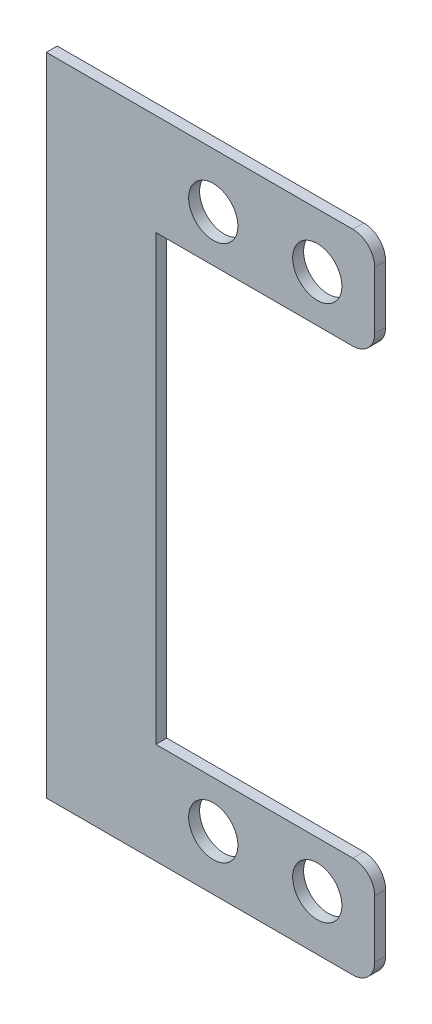
ISO-10303-21;
HEADER;
FILE_DESCRIPTION(('STEP AP214'),'2;1');
FILE_NAME('part.step','',(''),(''),'','','');
FILE_SCHEMA(('AUTOMOTIVE_DESIGN { 1 0 10303 214 1 1 1 1 }'));
ENDSEC;
DATA;
#1=APPLICATION_CONTEXT('core data for automotive mechanical design processes');
#2=APPLICATION_PROTOCOL_DEFINITION('international standard','automotive_design',2000,#1);
#3=PRODUCT_CONTEXT('',#1,'mechanical');
#4=PRODUCT('Part','Part','',(#3));
#5=PRODUCT_RELATED_PRODUCT_CATEGORY('part','',(#4));
#6=PRODUCT_DEFINITION_FORMATION('','',#4);
#7=PRODUCT_DEFINITION_CONTEXT('part definition',#1,'design');
#8=PRODUCT_DEFINITION('design','',#6,#7);
#9=PRODUCT_DEFINITION_SHAPE('','',#8);
#10=(LENGTH_UNIT() NAMED_UNIT(*) SI_UNIT(.MILLI.,.METRE.));
#11=(NAMED_UNIT(*) PLANE_ANGLE_UNIT() SI_UNIT($,.RADIAN.));
#12=(NAMED_UNIT(*) SI_UNIT($,.STERADIAN.) SOLID_ANGLE_UNIT());
#13=UNCERTAINTY_MEASURE_WITH_UNIT(LENGTH_MEASURE(1.E-05),#10,'distance_accuracy_value','');
#14=(GEOMETRIC_REPRESENTATION_CONTEXT(3) GLOBAL_UNCERTAINTY_ASSIGNED_CONTEXT((#13)) GLOBAL_UNIT_ASSIGNED_CONTEXT((#10,
#11,#12)) REPRESENTATION_CONTEXT('',''));
#15=CARTESIAN_POINT('',(0.,0.,0.));
#16=DIRECTION('',(0.,0.,1.));
#17=DIRECTION('',(1.,0.,0.));
#18=AXIS2_PLACEMENT_3D('',#15,#16,#17);
#19=CARTESIAN_POINT('',(18.,42.5,1.));
#20=DIRECTION('',(0.,0.,1.));
#21=DIRECTION('',(1.,0.,0.));
#22=AXIS2_PLACEMENT_3D('',#19,#20,#21);
#23=PLANE('',#22);
#24=CARTESIAN_POINT('',(14.75,-4.25,1.));
#25=DIRECTION('',(0.,0.,1.));
#26=DIRECTION('',(1.,0.,0.));
#27=AXIS2_PLACEMENT_3D('',#24,#25,#26);
#28=CIRCLE('',#27,2.25);
#29=CARTESIAN_POINT('',(17.,-4.25,1.));
#30=VERTEX_POINT('',#29);
#31=EDGE_CURVE('E295',#30,#30,#28,.T.);
#32=ORIENTED_EDGE('',*,*,#31,.F.);
#33=EDGE_LOOP('',(#32));
#34=FACE_BOUND('',#33,.T.);
#35=CARTESIAN_POINT('',(5.25,44.75,1.));
#36=DIRECTION('',(0.,0.,1.));
#37=DIRECTION('',(1.,0.,0.));
#38=AXIS2_PLACEMENT_3D('',#35,#36,#37);
#39=CIRCLE('',#38,2.25);
#40=CARTESIAN_POINT('',(7.5,44.75,1.));
#41=VERTEX_POINT('',#40);
#42=EDGE_CURVE('E161',#41,#41,#39,.T.);
#43=ORIENTED_EDGE('',*,*,#42,.F.);
#44=EDGE_LOOP('',(#43));
#45=FACE_BOUND('',#44,.T.);
#46=DIRECTION('',(0.,1.,0.));
#47=VECTOR('',#46,1.);
#48=CARTESIAN_POINT('',(0.,0.,1.));
#49=LINE('',#48,#47);
#50=CARTESIAN_POINT('',(0.,0.,1.));
#51=VERTEX_POINT('',#50);
#52=CARTESIAN_POINT('',(0.,40.5,1.));
#53=VERTEX_POINT('',#52);
#54=EDGE_CURVE('E180',#51,#53,#49,.T.);
#55=ORIENTED_EDGE('',*,*,#54,.T.);
#56=DIRECTION('',(1.,0.,0.));
#57=VECTOR('',#56,1.);
#58=CARTESIAN_POINT('',(0.,40.5,1.));
#59=LINE('',#58,#57);
#60=CARTESIAN_POINT('',(18.,40.5,1.));
#61=VERTEX_POINT('',#60);
#62=EDGE_CURVE('E108',#53,#61,#59,.T.);
#63=ORIENTED_EDGE('',*,*,#62,.T.);
#64=CARTESIAN_POINT('',(18.,42.5,1.));
#65=DIRECTION('',(0.,0.,1.));
#66=DIRECTION('',(1.,0.,0.));
#67=AXIS2_PLACEMENT_3D('',#64,#65,#66);
#68=CIRCLE('',#67,2.);
#69=CARTESIAN_POINT('',(20.,42.5,1.));
#70=VERTEX_POINT('',#69);
#71=EDGE_CURVE('E207',#61,#70,#68,.T.);
#72=ORIENTED_EDGE('',*,*,#71,.T.);
#73=DIRECTION('',(0.,1.,0.));
#74=VECTOR('',#73,1.);
#75=CARTESIAN_POINT('',(20.,42.5,1.));
#76=LINE('',#75,#74);
#77=CARTESIAN_POINT('',(20.,47.75,1.));
#78=VERTEX_POINT('',#77);
#79=EDGE_CURVE('E226',#70,#78,#76,.T.);
#80=ORIENTED_EDGE('',*,*,#79,.T.);
#81=CARTESIAN_POINT('',(18.,47.75,1.));
#82=DIRECTION('',(0.,0.,1.));
#83=DIRECTION('',(1.,0.,0.));
#84=AXIS2_PLACEMENT_3D('',#81,#82,#83);
#85=CIRCLE('',#84,2.);
#86=CARTESIAN_POINT('',(18.,49.75,1.));
#87=VERTEX_POINT('',#86);
#88=EDGE_CURVE('E223',#78,#87,#85,.T.);
#89=ORIENTED_EDGE('',*,*,#88,.T.);
#90=DIRECTION('',(-1.,0.,0.));
#91=VECTOR('',#90,1.);
#92=CARTESIAN_POINT('',(18.,49.75,1.));
#93=LINE('',#92,#91);
#94=CARTESIAN_POINT('',(-9.99999999999998,49.75,1.));
#95=VERTEX_POINT('',#94);
#96=EDGE_CURVE('E225',#87,#95,#93,.T.);
#97=ORIENTED_EDGE('',*,*,#96,.T.);
#98=DIRECTION('',(0.,-1.,0.));
#99=VECTOR('',#98,1.);
#100=CARTESIAN_POINT('',(-9.99999999999999,-9.25,1.));
#101=LINE('',#100,#99);
#102=CARTESIAN_POINT('',(-9.99999999999999,-9.25,1.));
#103=VERTEX_POINT('',#102);
#104=EDGE_CURVE('E228',#95,#103,#101,.T.);
#105=ORIENTED_EDGE('',*,*,#104,.T.);
#106=DIRECTION('',(1.,0.,0.));
#107=VECTOR('',#106,1.);
#108=CARTESIAN_POINT('',(18.,-9.25,1.));
#109=LINE('',#108,#107);
#110=CARTESIAN_POINT('',(18.,-9.25,1.));
#111=VERTEX_POINT('',#110);
#112=EDGE_CURVE('E234',#103,#111,#109,.T.);
#113=ORIENTED_EDGE('',*,*,#112,.T.);
#114=CARTESIAN_POINT('',(18.,-7.25,1.));
#115=DIRECTION('',(0.,0.,1.));
#116=DIRECTION('',(-1.,0.,0.));
#117=AXIS2_PLACEMENT_3D('',#114,#115,#116);
#118=CIRCLE('',#117,2.);
#119=CARTESIAN_POINT('',(20.,-7.24999999999999,1.));
#120=VERTEX_POINT('',#119);
#121=EDGE_CURVE('E139',#111,#120,#118,.T.);
#122=ORIENTED_EDGE('',*,*,#121,.T.);
#123=DIRECTION('',(0.,1.,0.));
#124=VECTOR('',#123,1.);
#125=CARTESIAN_POINT('',(20.,-7.24999999999999,1.));
#126=LINE('',#125,#124);
#127=CARTESIAN_POINT('',(20.,-2.00000000000001,1.));
#128=VERTEX_POINT('',#127);
#129=EDGE_CURVE('E133',#120,#128,#126,.T.);
#130=ORIENTED_EDGE('',*,*,#129,.T.);
#131=CARTESIAN_POINT('',(18.,-2.,1.));
#132=DIRECTION('',(0.,0.,1.));
#133=DIRECTION('',(-1.,0.,0.));
#134=AXIS2_PLACEMENT_3D('',#131,#132,#133);
#135=CIRCLE('',#134,2.);
#136=CARTESIAN_POINT('',(18.,0.,1.));
#137=VERTEX_POINT('',#136);
#138=EDGE_CURVE('E137',#128,#137,#135,.T.);
#139=ORIENTED_EDGE('',*,*,#138,.T.);
#140=DIRECTION('',(-1.,0.,0.));
#141=VECTOR('',#140,1.);
#142=CARTESIAN_POINT('',(0.,0.,1.));
#143=LINE('',#142,#141);
#144=EDGE_CURVE('E53',#137,#51,#143,.T.);
#145=ORIENTED_EDGE('',*,*,#144,.T.);
#146=EDGE_LOOP('',(#55,#63,#72,#80,#89,#97,#105,#113,#122,#130,#139,#145));
#147=FACE_BOUND('',#146,.T.);
#148=CARTESIAN_POINT('',(14.75,44.75,1.));
#149=DIRECTION('',(0.,0.,1.));
#150=DIRECTION('',(1.,0.,0.));
#151=AXIS2_PLACEMENT_3D('',#148,#149,#150);
#152=CIRCLE('',#151,2.25);
#153=CARTESIAN_POINT('',(17.,44.75,1.));
#154=VERTEX_POINT('',#153);
#155=EDGE_CURVE('E301',#154,#154,#152,.T.);
#156=ORIENTED_EDGE('',*,*,#155,.F.);
#157=EDGE_LOOP('',(#156));
#158=FACE_BOUND('',#157,.T.);
#159=CARTESIAN_POINT('',(5.25,-4.25,1.));
#160=DIRECTION('',(0.,0.,1.));
#161=DIRECTION('',(1.,0.,0.));
#162=AXIS2_PLACEMENT_3D('',#159,#160,#161);
#163=CIRCLE('',#162,2.25);
#164=CARTESIAN_POINT('',(7.5,-4.25,1.));
#165=VERTEX_POINT('',#164);
#166=EDGE_CURVE('E286',#165,#165,#163,.T.);
#167=ORIENTED_EDGE('',*,*,#166,.F.);
#168=EDGE_LOOP('',(#167));
#169=FACE_BOUND('',#168,.T.);
#170=ADVANCED_FACE('F36',(#34,#45,#147,#158,#169),#23,.T.);
#171=CARTESIAN_POINT('',(18.,42.5,0.));
#172=DIRECTION('',(0.,0.,1.));
#173=DIRECTION('',(1.,0.,0.));
#174=AXIS2_PLACEMENT_3D('',#171,#172,#173);
#175=PLANE('',#174);
#176=CARTESIAN_POINT('',(14.75,-4.25,0.));
#177=DIRECTION('',(0.,0.,1.));
#178=DIRECTION('',(1.,0.,0.));
#179=AXIS2_PLACEMENT_3D('',#176,#177,#178);
#180=CIRCLE('',#179,2.25);
#181=CARTESIAN_POINT('',(17.,-4.25,0.));
#182=VERTEX_POINT('',#181);
#183=EDGE_CURVE('E292',#182,#182,#180,.T.);
#184=ORIENTED_EDGE('',*,*,#183,.T.);
#185=EDGE_LOOP('',(#184));
#186=FACE_BOUND('',#185,.T.);
#187=CARTESIAN_POINT('',(5.25,44.75,0.));
#188=DIRECTION('',(0.,0.,1.));
#189=DIRECTION('',(1.,0.,0.));
#190=AXIS2_PLACEMENT_3D('',#187,#188,#189);
#191=CIRCLE('',#190,2.25);
#192=CARTESIAN_POINT('',(7.5,44.75,0.));
#193=VERTEX_POINT('',#192);
#194=EDGE_CURVE('E304',#193,#193,#191,.T.);
#195=ORIENTED_EDGE('',*,*,#194,.T.);
#196=EDGE_LOOP('',(#195));
#197=FACE_BOUND('',#196,.T.);
#198=DIRECTION('',(0.,1.,0.));
#199=VECTOR('',#198,1.);
#200=CARTESIAN_POINT('',(0.,0.,0.));
#201=LINE('',#200,#199);
#202=CARTESIAN_POINT('',(0.,0.,0.));
#203=VERTEX_POINT('',#202);
#204=CARTESIAN_POINT('',(0.,40.5,0.));
#205=VERTEX_POINT('',#204);
#206=EDGE_CURVE('E157',#203,#205,#201,.T.);
#207=ORIENTED_EDGE('',*,*,#206,.F.);
#208=DIRECTION('',(-1.,0.,0.));
#209=VECTOR('',#208,1.);
#210=CARTESIAN_POINT('',(0.,0.,0.));
#211=LINE('',#210,#209);
#212=CARTESIAN_POINT('',(18.,0.,0.));
#213=VERTEX_POINT('',#212);
#214=EDGE_CURVE('E100',#213,#203,#211,.T.);
#215=ORIENTED_EDGE('',*,*,#214,.F.);
#216=CARTESIAN_POINT('',(18.,-2.,0.));
#217=DIRECTION('',(0.,0.,1.));
#218=DIRECTION('',(-1.,0.,0.));
#219=AXIS2_PLACEMENT_3D('',#216,#217,#218);
#220=CIRCLE('',#219,2.);
#221=CARTESIAN_POINT('',(20.,-2.00000000000001,0.));
#222=VERTEX_POINT('',#221);
#223=EDGE_CURVE('E94',#222,#213,#220,.T.);
#224=ORIENTED_EDGE('',*,*,#223,.F.);
#225=DIRECTION('',(0.,1.,0.));
#226=VECTOR('',#225,1.);
#227=CARTESIAN_POINT('',(20.,-7.24999999999999,0.));
#228=LINE('',#227,#226);
#229=CARTESIAN_POINT('',(20.,-7.24999999999999,0.));
#230=VERTEX_POINT('',#229);
#231=EDGE_CURVE('E147',#230,#222,#228,.T.);
#232=ORIENTED_EDGE('',*,*,#231,.F.);
#233=CARTESIAN_POINT('',(18.,-7.25,0.));
#234=DIRECTION('',(0.,0.,1.));
#235=DIRECTION('',(-1.,0.,0.));
#236=AXIS2_PLACEMENT_3D('',#233,#234,#235);
#237=CIRCLE('',#236,2.);
#238=CARTESIAN_POINT('',(18.,-9.25,0.));
#239=VERTEX_POINT('',#238);
#240=EDGE_CURVE('E175',#239,#230,#237,.T.);
#241=ORIENTED_EDGE('',*,*,#240,.F.);
#242=DIRECTION('',(1.,0.,0.));
#243=VECTOR('',#242,1.);
#244=CARTESIAN_POINT('',(18.,-9.25,0.));
#245=LINE('',#244,#243);
#246=CARTESIAN_POINT('',(-9.99999999999999,-9.25,0.));
#247=VERTEX_POINT('',#246);
#248=EDGE_CURVE('E173',#247,#239,#245,.T.);
#249=ORIENTED_EDGE('',*,*,#248,.F.);
#250=DIRECTION('',(0.,-1.,0.));
#251=VECTOR('',#250,1.);
#252=CARTESIAN_POINT('',(-9.99999999999999,-9.25,0.));
#253=LINE('',#252,#251);
#254=CARTESIAN_POINT('',(-9.99999999999998,49.75,0.));
#255=VERTEX_POINT('',#254);
#256=EDGE_CURVE('E171',#255,#247,#253,.T.);
#257=ORIENTED_EDGE('',*,*,#256,.F.);
#258=DIRECTION('',(-1.,0.,0.));
#259=VECTOR('',#258,1.);
#260=CARTESIAN_POINT('',(18.,49.75,0.));
#261=LINE('',#260,#259);
#262=CARTESIAN_POINT('',(18.,49.75,0.));
#263=VERTEX_POINT('',#262);
#264=EDGE_CURVE('E169',#263,#255,#261,.T.);
#265=ORIENTED_EDGE('',*,*,#264,.F.);
#266=CARTESIAN_POINT('',(18.,47.75,0.));
#267=DIRECTION('',(0.,0.,1.));
#268=DIRECTION('',(1.,0.,0.));
#269=AXIS2_PLACEMENT_3D('',#266,#267,#268);
#270=CIRCLE('',#269,2.);
#271=CARTESIAN_POINT('',(20.,47.75,0.));
#272=VERTEX_POINT('',#271);
#273=EDGE_CURVE('E167',#272,#263,#270,.T.);
#274=ORIENTED_EDGE('',*,*,#273,.F.);
#275=DIRECTION('',(0.,1.,0.));
#276=VECTOR('',#275,1.);
#277=CARTESIAN_POINT('',(20.,42.5,0.));
#278=LINE('',#277,#276);
#279=CARTESIAN_POINT('',(20.,42.5,0.));
#280=VERTEX_POINT('',#279);
#281=EDGE_CURVE('E165',#280,#272,#278,.T.);
#282=ORIENTED_EDGE('',*,*,#281,.F.);
#283=CARTESIAN_POINT('',(18.,42.5,0.));
#284=DIRECTION('',(0.,0.,1.));
#285=DIRECTION('',(1.,0.,0.));
#286=AXIS2_PLACEMENT_3D('',#283,#284,#285);
#287=CIRCLE('',#286,2.);
#288=CARTESIAN_POINT('',(18.,40.5,0.));
#289=VERTEX_POINT('',#288);
#290=EDGE_CURVE('E163',#289,#280,#287,.T.);
#291=ORIENTED_EDGE('',*,*,#290,.F.);
#292=DIRECTION('',(1.,0.,0.));
#293=VECTOR('',#292,1.);
#294=CARTESIAN_POINT('',(0.,40.5,0.));
#295=LINE('',#294,#293);
#296=EDGE_CURVE('E160',#205,#289,#295,.T.);
#297=ORIENTED_EDGE('',*,*,#296,.F.);
#298=EDGE_LOOP('',(#207,#215,#224,#232,#241,#249,#257,#265,#274,#282,#291,#297));
#299=FACE_BOUND('',#298,.T.);
#300=CARTESIAN_POINT('',(14.75,44.75,0.));
#301=DIRECTION('',(0.,0.,1.));
#302=DIRECTION('',(1.,0.,0.));
#303=AXIS2_PLACEMENT_3D('',#300,#301,#302);
#304=CIRCLE('',#303,2.25);
#305=CARTESIAN_POINT('',(17.,44.75,0.));
#306=VERTEX_POINT('',#305);
#307=EDGE_CURVE('E298',#306,#306,#304,.T.);
#308=ORIENTED_EDGE('',*,*,#307,.T.);
#309=EDGE_LOOP('',(#308));
#310=FACE_BOUND('',#309,.T.);
#311=CARTESIAN_POINT('',(5.25,-4.25,0.));
#312=DIRECTION('',(0.,0.,1.));
#313=DIRECTION('',(1.,0.,0.));
#314=AXIS2_PLACEMENT_3D('',#311,#312,#313);
#315=CIRCLE('',#314,2.25);
#316=CARTESIAN_POINT('',(7.5,-4.25,0.));
#317=VERTEX_POINT('',#316);
#318=EDGE_CURVE('E289',#317,#317,#315,.T.);
#319=ORIENTED_EDGE('',*,*,#318,.T.);
#320=EDGE_LOOP('',(#319));
#321=FACE_BOUND('',#320,.T.);
#322=ADVANCED_FACE('F211',(#186,#197,#299,#310,#321),#175,.F.);
#323=CARTESIAN_POINT('',(0.,0.,1.));
#324=DIRECTION('',(-1.,0.,0.));
#325=DIRECTION('',(0.,0.,1.));
#326=AXIS2_PLACEMENT_3D('',#323,#324,#325);
#327=PLANE('',#326);
#328=ORIENTED_EDGE('',*,*,#206,.T.);
#329=DIRECTION('',(0.,0.,-1.));
#330=VECTOR('',#329,1.);
#331=CARTESIAN_POINT('',(0.,40.5,1.));
#332=LINE('',#331,#330);
#333=EDGE_CURVE('E11',#53,#205,#332,.T.);
#334=ORIENTED_EDGE('',*,*,#333,.F.);
#335=ORIENTED_EDGE('',*,*,#54,.F.);
#336=DIRECTION('',(0.,0.,-1.));
#337=VECTOR('',#336,1.);
#338=CARTESIAN_POINT('',(0.,0.,1.));
#339=LINE('',#338,#337);
#340=EDGE_CURVE('E153',#51,#203,#339,.T.);
#341=ORIENTED_EDGE('',*,*,#340,.T.);
#342=EDGE_LOOP('',(#328,#334,#335,#341));
#343=FACE_BOUND('',#342,.T.);
#344=ADVANCED_FACE('F38',(#343),#327,.F.);
#345=CARTESIAN_POINT('',(0.,40.5,1.));
#346=DIRECTION('',(0.,1.,0.));
#347=DIRECTION('',(0.,0.,1.));
#348=AXIS2_PLACEMENT_3D('',#345,#346,#347);
#349=PLANE('',#348);
#350=ORIENTED_EDGE('',*,*,#296,.T.);
#351=DIRECTION('',(0.,0.,-1.));
#352=VECTOR('',#351,1.);
#353=CARTESIAN_POINT('',(18.,40.5,1.));
#354=LINE('',#353,#352);
#355=EDGE_CURVE('E45',#61,#289,#354,.T.);
#356=ORIENTED_EDGE('',*,*,#355,.F.);
#357=ORIENTED_EDGE('',*,*,#62,.F.);
#358=ORIENTED_EDGE('',*,*,#333,.T.);
#359=EDGE_LOOP('',(#350,#356,#357,#358));
#360=FACE_BOUND('',#359,.T.);
#361=ADVANCED_FACE('F413',(#360),#349,.F.);
#362=CARTESIAN_POINT('',(18.,42.5,1.));
#363=DIRECTION('',(0.,0.,-1.));
#364=DIRECTION('',(-1.,0.,0.));
#365=AXIS2_PLACEMENT_3D('',#362,#363,#364);
#366=CYLINDRICAL_SURFACE('',#365,2.);
#367=ORIENTED_EDGE('',*,*,#290,.T.);
#368=DIRECTION('',(0.,0.,-1.));
#369=VECTOR('',#368,1.);
#370=CARTESIAN_POINT('',(20.,42.5,1.));
#371=LINE('',#370,#369);
#372=EDGE_CURVE('E199',#70,#280,#371,.T.);
#373=ORIENTED_EDGE('',*,*,#372,.F.);
#374=ORIENTED_EDGE('',*,*,#71,.F.);
#375=ORIENTED_EDGE('',*,*,#355,.T.);
#376=EDGE_LOOP('',(#367,#373,#374,#375));
#377=FACE_BOUND('',#376,.T.);
#378=ADVANCED_FACE('F205',(#377),#366,.T.);
#379=CARTESIAN_POINT('',(20.,42.5,1.));
#380=DIRECTION('',(-1.,0.,0.));
#381=DIRECTION('',(0.,0.,1.));
#382=AXIS2_PLACEMENT_3D('',#379,#380,#381);
#383=PLANE('',#382);
#384=ORIENTED_EDGE('',*,*,#281,.T.);
#385=DIRECTION('',(0.,0.,-1.));
#386=VECTOR('',#385,1.);
#387=CARTESIAN_POINT('',(20.,47.75,1.));
#388=LINE('',#387,#386);
#389=EDGE_CURVE('E196',#78,#272,#388,.T.);
#390=ORIENTED_EDGE('',*,*,#389,.F.);
#391=ORIENTED_EDGE('',*,*,#79,.F.);
#392=ORIENTED_EDGE('',*,*,#372,.T.);
#393=EDGE_LOOP('',(#384,#390,#391,#392));
#394=FACE_BOUND('',#393,.T.);
#395=ADVANCED_FACE('F217',(#394),#383,.F.);
#396=CARTESIAN_POINT('',(18.,47.75,1.));
#397=DIRECTION('',(0.,0.,-1.));
#398=DIRECTION('',(-1.,0.,0.));
#399=AXIS2_PLACEMENT_3D('',#396,#397,#398);
#400=CYLINDRICAL_SURFACE('',#399,2.);
#401=ORIENTED_EDGE('',*,*,#273,.T.);
#402=DIRECTION('',(0.,0.,-1.));
#403=VECTOR('',#402,1.);
#404=CARTESIAN_POINT('',(18.,49.75,1.));
#405=LINE('',#404,#403);
#406=EDGE_CURVE('E193',#87,#263,#405,.T.);
#407=ORIENTED_EDGE('',*,*,#406,.F.);
#408=ORIENTED_EDGE('',*,*,#88,.F.);
#409=ORIENTED_EDGE('',*,*,#389,.T.);
#410=EDGE_LOOP('',(#401,#407,#408,#409));
#411=FACE_BOUND('',#410,.T.);
#412=ADVANCED_FACE('F221',(#411),#400,.T.);
#413=CARTESIAN_POINT('',(18.,49.75,1.));
#414=DIRECTION('',(0.,-1.,0.));
#415=DIRECTION('',(0.,0.,-1.));
#416=AXIS2_PLACEMENT_3D('',#413,#414,#415);
#417=PLANE('',#416);
#418=ORIENTED_EDGE('',*,*,#264,.T.);
#419=DIRECTION('',(0.,0.,-1.));
#420=VECTOR('',#419,1.);
#421=CARTESIAN_POINT('',(-9.99999999999998,49.75,1.));
#422=LINE('',#421,#420);
#423=EDGE_CURVE('E190',#95,#255,#422,.T.);
#424=ORIENTED_EDGE('',*,*,#423,.F.);
#425=ORIENTED_EDGE('',*,*,#96,.F.);
#426=ORIENTED_EDGE('',*,*,#406,.T.);
#427=EDGE_LOOP('',(#418,#424,#425,#426));
#428=FACE_BOUND('',#427,.T.);
#429=ADVANCED_FACE('F378',(#428),#417,.F.);
#430=CARTESIAN_POINT('',(-9.99999999999999,-9.25,1.));
#431=DIRECTION('',(1.,0.,0.));
#432=DIRECTION('',(0.,1.,0.));
#433=AXIS2_PLACEMENT_3D('',#430,#431,#432);
#434=PLANE('',#433);
#435=ORIENTED_EDGE('',*,*,#256,.T.);
#436=DIRECTION('',(0.,0.,-1.));
#437=VECTOR('',#436,1.);
#438=CARTESIAN_POINT('',(-9.99999999999999,-9.25,1.));
#439=LINE('',#438,#437);
#440=EDGE_CURVE('E187',#103,#247,#439,.T.);
#441=ORIENTED_EDGE('',*,*,#440,.F.);
#442=ORIENTED_EDGE('',*,*,#104,.F.);
#443=ORIENTED_EDGE('',*,*,#423,.T.);
#444=EDGE_LOOP('',(#435,#441,#442,#443));
#445=FACE_BOUND('',#444,.T.);
#446=ADVANCED_FACE('F369',(#445),#434,.F.);
#447=CARTESIAN_POINT('',(18.,-9.25,1.));
#448=DIRECTION('',(0.,1.,0.));
#449=DIRECTION('',(0.,0.,1.));
#450=AXIS2_PLACEMENT_3D('',#447,#448,#449);
#451=PLANE('',#450);
#452=ORIENTED_EDGE('',*,*,#248,.T.);
#453=DIRECTION('',(0.,0.,-1.));
#454=VECTOR('',#453,1.);
#455=CARTESIAN_POINT('',(18.,-9.25,1.));
#456=LINE('',#455,#454);
#457=EDGE_CURVE('E184',#111,#239,#456,.T.);
#458=ORIENTED_EDGE('',*,*,#457,.F.);
#459=ORIENTED_EDGE('',*,*,#112,.F.);
#460=ORIENTED_EDGE('',*,*,#440,.T.);
#461=EDGE_LOOP('',(#452,#458,#459,#460));
#462=FACE_BOUND('',#461,.T.);
#463=ADVANCED_FACE('F240',(#462),#451,.F.);
#464=CARTESIAN_POINT('',(18.,-7.25,1.));
#465=DIRECTION('',(0.,0.,-1.));
#466=DIRECTION('',(-1.,0.,0.));
#467=AXIS2_PLACEMENT_3D('',#464,#465,#466);
#468=CYLINDRICAL_SURFACE('',#467,2.);
#469=ORIENTED_EDGE('',*,*,#240,.T.);
#470=DIRECTION('',(0.,0.,-1.));
#471=VECTOR('',#470,1.);
#472=CARTESIAN_POINT('',(20.,-7.24999999999999,1.));
#473=LINE('',#472,#471);
#474=EDGE_CURVE('E148',#120,#230,#473,.T.);
#475=ORIENTED_EDGE('',*,*,#474,.F.);
#476=ORIENTED_EDGE('',*,*,#121,.F.);
#477=ORIENTED_EDGE('',*,*,#457,.T.);
#478=EDGE_LOOP('',(#469,#475,#476,#477));
#479=FACE_BOUND('',#478,.T.);
#480=ADVANCED_FACE('F244',(#479),#468,.T.);
#481=CARTESIAN_POINT('',(20.,-7.24999999999999,1.));
#482=DIRECTION('',(-1.,0.,0.));
#483=DIRECTION('',(0.,-1.,0.));
#484=AXIS2_PLACEMENT_3D('',#481,#482,#483);
#485=PLANE('',#484);
#486=ORIENTED_EDGE('',*,*,#231,.T.);
#487=DIRECTION('',(0.,0.,-1.));
#488=VECTOR('',#487,1.);
#489=CARTESIAN_POINT('',(20.,-2.00000000000001,1.));
#490=LINE('',#489,#488);
#491=EDGE_CURVE('E144',#128,#222,#490,.T.);
#492=ORIENTED_EDGE('',*,*,#491,.F.);
#493=ORIENTED_EDGE('',*,*,#129,.F.);
#494=ORIENTED_EDGE('',*,*,#474,.T.);
#495=EDGE_LOOP('',(#486,#492,#493,#494));
#496=FACE_BOUND('',#495,.T.);
#497=ADVANCED_FACE('F145',(#496),#485,.F.);
#498=CARTESIAN_POINT('',(18.,-2.,1.));
#499=DIRECTION('',(0.,0.,-1.));
#500=DIRECTION('',(-1.,0.,0.));
#501=AXIS2_PLACEMENT_3D('',#498,#499,#500);
#502=CYLINDRICAL_SURFACE('',#501,2.);
#503=ORIENTED_EDGE('',*,*,#223,.T.);
#504=DIRECTION('',(0.,0.,-1.));
#505=VECTOR('',#504,1.);
#506=CARTESIAN_POINT('',(18.,0.,1.));
#507=LINE('',#506,#505);
#508=EDGE_CURVE('E149',#137,#213,#507,.T.);
#509=ORIENTED_EDGE('',*,*,#508,.F.);
#510=ORIENTED_EDGE('',*,*,#138,.F.);
#511=ORIENTED_EDGE('',*,*,#491,.T.);
#512=EDGE_LOOP('',(#503,#509,#510,#511));
#513=FACE_BOUND('',#512,.T.);
#514=ADVANCED_FACE('F151',(#513),#502,.T.);
#515=CARTESIAN_POINT('',(0.,0.,1.));
#516=DIRECTION('',(0.,-1.,0.));
#517=DIRECTION('',(0.,0.,-1.));
#518=AXIS2_PLACEMENT_3D('',#515,#516,#517);
#519=PLANE('',#518);
#520=ORIENTED_EDGE('',*,*,#214,.T.);
#521=ORIENTED_EDGE('',*,*,#340,.F.);
#522=ORIENTED_EDGE('',*,*,#144,.F.);
#523=ORIENTED_EDGE('',*,*,#508,.T.);
#524=EDGE_LOOP('',(#520,#521,#522,#523));
#525=FACE_BOUND('',#524,.T.);
#526=ADVANCED_FACE('F248',(#525),#519,.F.);
#527=CARTESIAN_POINT('',(5.25,44.75,1.));
#528=DIRECTION('',(0.,0.,-1.));
#529=DIRECTION('',(-1.,0.,0.));
#530=AXIS2_PLACEMENT_3D('',#527,#528,#529);
#531=CYLINDRICAL_SURFACE('',#530,2.25);
#532=ORIENTED_EDGE('',*,*,#42,.T.);
#533=EDGE_LOOP('',(#532));
#534=FACE_BOUND('',#533,.T.);
#535=ORIENTED_EDGE('',*,*,#194,.F.);
#536=EDGE_LOOP('',(#535));
#537=FACE_BOUND('',#536,.T.);
#538=ADVANCED_FACE('F250',(#534,#537),#531,.F.);
#539=CARTESIAN_POINT('',(14.75,44.75,1.));
#540=DIRECTION('',(0.,0.,-1.));
#541=DIRECTION('',(-1.,0.,0.));
#542=AXIS2_PLACEMENT_3D('',#539,#540,#541);
#543=CYLINDRICAL_SURFACE('',#542,2.25);
#544=ORIENTED_EDGE('',*,*,#155,.T.);
#545=EDGE_LOOP('',(#544));
#546=FACE_BOUND('',#545,.T.);
#547=ORIENTED_EDGE('',*,*,#307,.F.);
#548=EDGE_LOOP('',(#547));
#549=FACE_BOUND('',#548,.T.);
#550=ADVANCED_FACE('F256',(#546,#549),#543,.F.);
#551=CARTESIAN_POINT('',(14.75,-4.25,1.));
#552=DIRECTION('',(0.,0.,-1.));
#553=DIRECTION('',(-1.,0.,0.));
#554=AXIS2_PLACEMENT_3D('',#551,#552,#553);
#555=CYLINDRICAL_SURFACE('',#554,2.25);
#556=ORIENTED_EDGE('',*,*,#31,.T.);
#557=EDGE_LOOP('',(#556));
#558=FACE_BOUND('',#557,.T.);
#559=ORIENTED_EDGE('',*,*,#183,.F.);
#560=EDGE_LOOP('',(#559));
#561=FACE_BOUND('',#560,.T.);
#562=ADVANCED_FACE('F273',(#558,#561),#555,.F.);
#563=CARTESIAN_POINT('',(5.25,-4.25,1.));
#564=DIRECTION('',(0.,0.,-1.));
#565=DIRECTION('',(-1.,0.,0.));
#566=AXIS2_PLACEMENT_3D('',#563,#564,#565);
#567=CYLINDRICAL_SURFACE('',#566,2.25);
#568=ORIENTED_EDGE('',*,*,#166,.T.);
#569=EDGE_LOOP('',(#568));
#570=FACE_BOUND('',#569,.T.);
#571=ORIENTED_EDGE('',*,*,#318,.F.);
#572=EDGE_LOOP('',(#571));
#573=FACE_BOUND('',#572,.T.);
#574=ADVANCED_FACE('F277',(#570,#573),#567,.F.);
#575=CLOSED_SHELL('',(#170,#322,#344,#361,#378,#395,#412,#429,#446,#463,#480,#497,#514,#526,
#538,#550,#562,#574));
#576=MANIFOLD_SOLID_BREP('B2',#575);
#577=ADVANCED_BREP_SHAPE_REPRESENTATION('',(#18,#576),#14);
#578=SHAPE_DEFINITION_REPRESENTATION(#9,#577);
ENDSEC;
END-ISO-10303-21;
